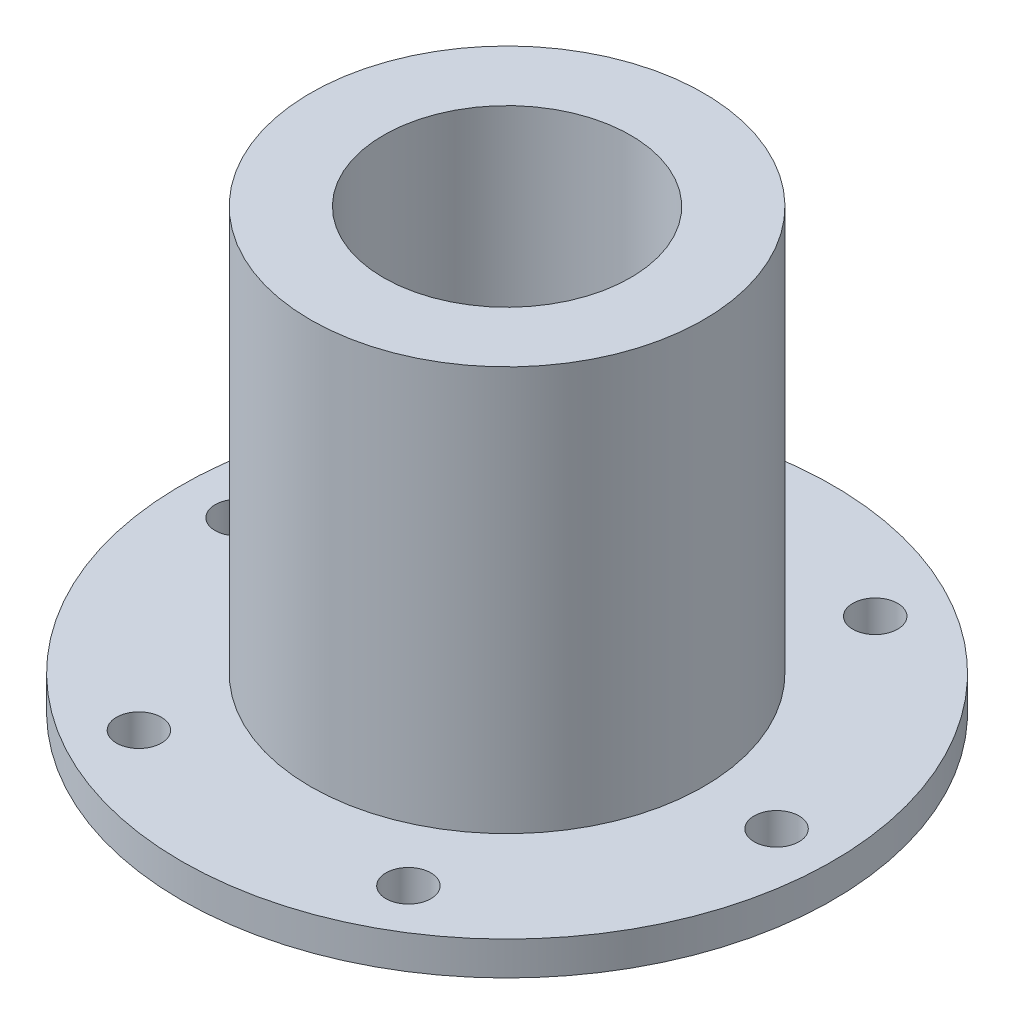
ISO-10303-21;
HEADER;
FILE_DESCRIPTION(('STEP AP214'),'2;1');
FILE_NAME('part.step','',(''),(''),'','','');
FILE_SCHEMA(('AUTOMOTIVE_DESIGN { 1 0 10303 214 1 1 1 1 }'));
ENDSEC;
DATA;
#1=APPLICATION_CONTEXT('core data for automotive mechanical design processes');
#2=APPLICATION_PROTOCOL_DEFINITION('international standard','automotive_design',2000,#1);
#3=PRODUCT_CONTEXT('',#1,'mechanical');
#4=PRODUCT('Part','Part','',(#3));
#5=PRODUCT_RELATED_PRODUCT_CATEGORY('part','',(#4));
#6=PRODUCT_DEFINITION_FORMATION('','',#4);
#7=PRODUCT_DEFINITION_CONTEXT('part definition',#1,'design');
#8=PRODUCT_DEFINITION('design','',#6,#7);
#9=PRODUCT_DEFINITION_SHAPE('','',#8);
#10=(LENGTH_UNIT() NAMED_UNIT(*) SI_UNIT(.MILLI.,.METRE.));
#11=(NAMED_UNIT(*) PLANE_ANGLE_UNIT() SI_UNIT($,.RADIAN.));
#12=(NAMED_UNIT(*) SI_UNIT($,.STERADIAN.) SOLID_ANGLE_UNIT());
#13=UNCERTAINTY_MEASURE_WITH_UNIT(LENGTH_MEASURE(1.E-05),#10,'distance_accuracy_value','');
#14=(GEOMETRIC_REPRESENTATION_CONTEXT(3) GLOBAL_UNCERTAINTY_ASSIGNED_CONTEXT((#13)) GLOBAL_UNIT_ASSIGNED_CONTEXT((#10,
#11,#12)) REPRESENTATION_CONTEXT('',''));
#15=CARTESIAN_POINT('',(0.,0.,0.));
#16=DIRECTION('',(0.,0.,1.));
#17=DIRECTION('',(1.,0.,0.));
#18=AXIS2_PLACEMENT_3D('',#15,#16,#17);
#19=CARTESIAN_POINT('',(0.,3.,0.));
#20=DIRECTION('',(0.,-1.,0.));
#21=DIRECTION('',(0.,0.,-1.));
#22=AXIS2_PLACEMENT_3D('',#19,#20,#21);
#23=CYLINDRICAL_SURFACE('',#22,29.);
#24=CARTESIAN_POINT('',(0.,3.,0.));
#25=DIRECTION('',(0.,1.,0.));
#26=DIRECTION('',(0.,0.,1.));
#27=AXIS2_PLACEMENT_3D('',#24,#25,#26);
#28=CIRCLE('',#27,29.);
#29=CARTESIAN_POINT('',(0.,3.,29.));
#30=VERTEX_POINT('',#29);
#31=EDGE_CURVE('E46',#30,#30,#28,.T.);
#32=ORIENTED_EDGE('',*,*,#31,.F.);
#33=EDGE_LOOP('',(#32));
#34=FACE_BOUND('',#33,.T.);
#35=CARTESIAN_POINT('',(0.,0.,0.));
#36=DIRECTION('',(0.,1.,0.));
#37=DIRECTION('',(0.,0.,1.));
#38=AXIS2_PLACEMENT_3D('',#35,#36,#37);
#39=CIRCLE('',#38,29.);
#40=CARTESIAN_POINT('',(0.,0.,29.));
#41=VERTEX_POINT('',#40);
#42=EDGE_CURVE('E51',#41,#41,#39,.T.);
#43=ORIENTED_EDGE('',*,*,#42,.T.);
#44=EDGE_LOOP('',(#43));
#45=FACE_BOUND('',#44,.T.);
#46=ADVANCED_FACE('F39',(#34,#45),#23,.T.);
#47=CARTESIAN_POINT('',(0.,3.,0.));
#48=DIRECTION('',(0.,1.,0.));
#49=DIRECTION('',(0.,0.,1.));
#50=AXIS2_PLACEMENT_3D('',#47,#48,#49);
#51=PLANE('',#50);
#52=CARTESIAN_POINT('',(24.,3.,0.));
#53=DIRECTION('',(0.,1.,0.));
#54=DIRECTION('',(0.,0.,1.));
#55=AXIS2_PLACEMENT_3D('',#52,#53,#54);
#56=CIRCLE('',#55,2.);
#57=CARTESIAN_POINT('',(24.,3.,2.));
#58=VERTEX_POINT('',#57);
#59=EDGE_CURVE('E63',#58,#58,#56,.T.);
#60=ORIENTED_EDGE('',*,*,#59,.F.);
#61=EDGE_LOOP('',(#60));
#62=FACE_BOUND('',#61,.T.);
#63=CARTESIAN_POINT('',(12.0000000000002,3.,-20.7846096908264));
#64=DIRECTION('',(0.,1.,0.));
#65=DIRECTION('',(0.,0.,1.));
#66=AXIS2_PLACEMENT_3D('',#63,#64,#65);
#67=CIRCLE('',#66,2.);
#68=CARTESIAN_POINT('',(12.0000000000002,3.,-18.7846096908264));
#69=VERTEX_POINT('',#68);
#70=EDGE_CURVE('E90',#69,#69,#67,.T.);
#71=ORIENTED_EDGE('',*,*,#70,.F.);
#72=EDGE_LOOP('',(#71));
#73=FACE_BOUND('',#72,.T.);
#74=CARTESIAN_POINT('',(-11.9999999999998,3.,-20.7846096908266));
#75=DIRECTION('',(0.,1.,0.));
#76=DIRECTION('',(0.,0.,1.));
#77=AXIS2_PLACEMENT_3D('',#74,#75,#76);
#78=CIRCLE('',#77,2.);
#79=CARTESIAN_POINT('',(-11.9999999999998,3.,-18.7846096908266));
#80=VERTEX_POINT('',#79);
#81=EDGE_CURVE('E86',#80,#80,#78,.T.);
#82=ORIENTED_EDGE('',*,*,#81,.F.);
#83=EDGE_LOOP('',(#82));
#84=FACE_BOUND('',#83,.T.);
#85=CARTESIAN_POINT('',(-24.,3.,-1.6759110426447E-13));
#86=DIRECTION('',(0.,1.,0.));
#87=DIRECTION('',(0.,0.,1.));
#88=AXIS2_PLACEMENT_3D('',#85,#86,#87);
#89=CIRCLE('',#88,2.);
#90=CARTESIAN_POINT('',(-24.,3.,1.99999999999983));
#91=VERTEX_POINT('',#90);
#92=EDGE_CURVE('E89',#91,#91,#89,.T.);
#93=ORIENTED_EDGE('',*,*,#92,.F.);
#94=EDGE_LOOP('',(#93));
#95=FACE_BOUND('',#94,.T.);
#96=CARTESIAN_POINT('',(-12.0000000000001,3.,20.7846096908265));
#97=DIRECTION('',(0.,1.,0.));
#98=DIRECTION('',(0.,0.,1.));
#99=AXIS2_PLACEMENT_3D('',#96,#97,#98);
#100=CIRCLE('',#99,2.);
#101=CARTESIAN_POINT('',(-12.0000000000001,3.,22.7846096908265));
#102=VERTEX_POINT('',#101);
#103=EDGE_CURVE('E93',#102,#102,#100,.T.);
#104=ORIENTED_EDGE('',*,*,#103,.F.);
#105=EDGE_LOOP('',(#104));
#106=FACE_BOUND('',#105,.T.);
#107=CARTESIAN_POINT('',(12.,3.,20.7846096908266));
#108=DIRECTION('',(0.,1.,0.));
#109=DIRECTION('',(0.,0.,1.));
#110=AXIS2_PLACEMENT_3D('',#107,#108,#109);
#111=CIRCLE('',#110,2.);
#112=CARTESIAN_POINT('',(12.,3.,22.7846096908266));
#113=VERTEX_POINT('',#112);
#114=EDGE_CURVE('E96',#113,#113,#111,.T.);
#115=ORIENTED_EDGE('',*,*,#114,.F.);
#116=EDGE_LOOP('',(#115));
#117=FACE_BOUND('',#116,.T.);
#118=CARTESIAN_POINT('',(0.,3.,0.));
#119=DIRECTION('',(0.,1.,0.));
#120=DIRECTION('',(0.,0.,1.));
#121=AXIS2_PLACEMENT_3D('',#118,#119,#120);
#122=CIRCLE('',#121,17.5);
#123=CARTESIAN_POINT('',(0.,3.,17.5));
#124=VERTEX_POINT('',#123);
#125=EDGE_CURVE('E10',#124,#124,#122,.T.);
#126=ORIENTED_EDGE('',*,*,#125,.F.);
#127=EDGE_LOOP('',(#126));
#128=FACE_BOUND('',#127,.T.);
#129=ORIENTED_EDGE('',*,*,#31,.T.);
#130=EDGE_LOOP('',(#129));
#131=FACE_BOUND('',#130,.T.);
#132=ADVANCED_FACE('F107',(#62,#73,#84,#95,#106,#117,#128,#131),#51,.T.);
#133=CARTESIAN_POINT('',(0.,0.,0.));
#134=DIRECTION('',(0.,1.,0.));
#135=DIRECTION('',(0.,0.,1.));
#136=AXIS2_PLACEMENT_3D('',#133,#134,#135);
#137=PLANE('',#136);
#138=CARTESIAN_POINT('',(24.,0.,0.));
#139=DIRECTION('',(0.,1.,0.));
#140=DIRECTION('',(0.,0.,1.));
#141=AXIS2_PLACEMENT_3D('',#138,#139,#140);
#142=CIRCLE('',#141,2.);
#143=CARTESIAN_POINT('',(24.,0.,2.));
#144=VERTEX_POINT('',#143);
#145=EDGE_CURVE('E42',#144,#144,#142,.T.);
#146=ORIENTED_EDGE('',*,*,#145,.T.);
#147=EDGE_LOOP('',(#146));
#148=FACE_BOUND('',#147,.T.);
#149=CARTESIAN_POINT('',(12.0000000000002,0.,-20.7846096908264));
#150=DIRECTION('',(0.,1.,0.));
#151=DIRECTION('',(0.,0.,1.));
#152=AXIS2_PLACEMENT_3D('',#149,#150,#151);
#153=CIRCLE('',#152,2.);
#154=CARTESIAN_POINT('',(12.0000000000002,0.,-18.7846096908264));
#155=VERTEX_POINT('',#154);
#156=EDGE_CURVE('E71',#155,#155,#153,.T.);
#157=ORIENTED_EDGE('',*,*,#156,.T.);
#158=EDGE_LOOP('',(#157));
#159=FACE_BOUND('',#158,.T.);
#160=CARTESIAN_POINT('',(-11.9999999999998,0.,-20.7846096908266));
#161=DIRECTION('',(0.,1.,0.));
#162=DIRECTION('',(0.,0.,1.));
#163=AXIS2_PLACEMENT_3D('',#160,#161,#162);
#164=CIRCLE('',#163,2.);
#165=CARTESIAN_POINT('',(-11.9999999999998,0.,-18.7846096908266));
#166=VERTEX_POINT('',#165);
#167=EDGE_CURVE('E69',#166,#166,#164,.T.);
#168=ORIENTED_EDGE('',*,*,#167,.T.);
#169=EDGE_LOOP('',(#168));
#170=FACE_BOUND('',#169,.T.);
#171=CARTESIAN_POINT('',(-24.,0.,-1.6759110426447E-13));
#172=DIRECTION('',(0.,1.,0.));
#173=DIRECTION('',(0.,0.,1.));
#174=AXIS2_PLACEMENT_3D('',#171,#172,#173);
#175=CIRCLE('',#174,2.);
#176=CARTESIAN_POINT('',(-24.,0.,1.99999999999983));
#177=VERTEX_POINT('',#176);
#178=EDGE_CURVE('E66',#177,#177,#175,.T.);
#179=ORIENTED_EDGE('',*,*,#178,.T.);
#180=EDGE_LOOP('',(#179));
#181=FACE_BOUND('',#180,.T.);
#182=CARTESIAN_POINT('',(-12.0000000000001,0.,20.7846096908265));
#183=DIRECTION('',(0.,1.,0.));
#184=DIRECTION('',(0.,0.,1.));
#185=AXIS2_PLACEMENT_3D('',#182,#183,#184);
#186=CIRCLE('',#185,2.);
#187=CARTESIAN_POINT('',(-12.0000000000001,0.,22.7846096908265));
#188=VERTEX_POINT('',#187);
#189=EDGE_CURVE('E62',#188,#188,#186,.T.);
#190=ORIENTED_EDGE('',*,*,#189,.T.);
#191=EDGE_LOOP('',(#190));
#192=FACE_BOUND('',#191,.T.);
#193=CARTESIAN_POINT('',(12.,0.,20.7846096908266));
#194=DIRECTION('',(0.,1.,0.));
#195=DIRECTION('',(0.,0.,1.));
#196=AXIS2_PLACEMENT_3D('',#193,#194,#195);
#197=CIRCLE('',#196,2.);
#198=CARTESIAN_POINT('',(12.,0.,22.7846096908266));
#199=VERTEX_POINT('',#198);
#200=EDGE_CURVE('E59',#199,#199,#197,.T.);
#201=ORIENTED_EDGE('',*,*,#200,.T.);
#202=EDGE_LOOP('',(#201));
#203=FACE_BOUND('',#202,.T.);
#204=CARTESIAN_POINT('',(0.,0.,0.));
#205=DIRECTION('',(0.,1.,0.));
#206=DIRECTION('',(0.,0.,1.));
#207=AXIS2_PLACEMENT_3D('',#204,#205,#206);
#208=CIRCLE('',#207,11.);
#209=CARTESIAN_POINT('',(0.,0.,11.));
#210=VERTEX_POINT('',#209);
#211=EDGE_CURVE('E80',#210,#210,#208,.T.);
#212=ORIENTED_EDGE('',*,*,#211,.T.);
#213=EDGE_LOOP('',(#212));
#214=FACE_BOUND('',#213,.T.);
#215=ORIENTED_EDGE('',*,*,#42,.F.);
#216=EDGE_LOOP('',(#215));
#217=FACE_BOUND('',#216,.T.);
#218=ADVANCED_FACE('F110',(#148,#159,#170,#181,#192,#203,#214,#217),#137,.F.);
#219=CARTESIAN_POINT('',(0.,39.,0.));
#220=DIRECTION('',(0.,-1.,0.));
#221=DIRECTION('',(0.,0.,-1.));
#222=AXIS2_PLACEMENT_3D('',#219,#220,#221);
#223=CYLINDRICAL_SURFACE('',#222,17.5);
#224=CARTESIAN_POINT('',(0.,39.,0.));
#225=DIRECTION('',(0.,1.,0.));
#226=DIRECTION('',(0.,0.,1.));
#227=AXIS2_PLACEMENT_3D('',#224,#225,#226);
#228=CIRCLE('',#227,17.5);
#229=CARTESIAN_POINT('',(0.,39.,17.5));
#230=VERTEX_POINT('',#229);
#231=EDGE_CURVE('E54',#230,#230,#228,.T.);
#232=ORIENTED_EDGE('',*,*,#231,.F.);
#233=EDGE_LOOP('',(#232));
#234=FACE_BOUND('',#233,.T.);
#235=ORIENTED_EDGE('',*,*,#125,.T.);
#236=EDGE_LOOP('',(#235));
#237=FACE_BOUND('',#236,.T.);
#238=ADVANCED_FACE('F130',(#234,#237),#223,.T.);
#239=CARTESIAN_POINT('',(0.,39.,0.));
#240=DIRECTION('',(0.,1.,0.));
#241=DIRECTION('',(0.,0.,1.));
#242=AXIS2_PLACEMENT_3D('',#239,#240,#241);
#243=PLANE('',#242);
#244=CARTESIAN_POINT('',(0.,39.,0.));
#245=DIRECTION('',(0.,1.,0.));
#246=DIRECTION('',(0.,0.,1.));
#247=AXIS2_PLACEMENT_3D('',#244,#245,#246);
#248=CIRCLE('',#247,11.);
#249=CARTESIAN_POINT('',(0.,39.,11.));
#250=VERTEX_POINT('',#249);
#251=EDGE_CURVE('E76',#250,#250,#248,.T.);
#252=ORIENTED_EDGE('',*,*,#251,.F.);
#253=EDGE_LOOP('',(#252));
#254=FACE_BOUND('',#253,.T.);
#255=ORIENTED_EDGE('',*,*,#231,.T.);
#256=EDGE_LOOP('',(#255));
#257=FACE_BOUND('',#256,.T.);
#258=ADVANCED_FACE('F135',(#254,#257),#243,.T.);
#259=CARTESIAN_POINT('',(0.,0.,0.));
#260=DIRECTION('',(0.,1.,0.));
#261=DIRECTION('',(0.,0.,1.));
#262=AXIS2_PLACEMENT_3D('',#259,#260,#261);
#263=CYLINDRICAL_SURFACE('',#262,11.);
#264=ORIENTED_EDGE('',*,*,#211,.F.);
#265=EDGE_LOOP('',(#264));
#266=FACE_BOUND('',#265,.T.);
#267=ORIENTED_EDGE('',*,*,#251,.T.);
#268=EDGE_LOOP('',(#267));
#269=FACE_BOUND('',#268,.T.);
#270=ADVANCED_FACE('F141',(#266,#269),#263,.F.);
#271=CARTESIAN_POINT('',(12.,-7.,20.7846096908266));
#272=DIRECTION('',(0.,1.,0.));
#273=DIRECTION('',(0.,0.,1.));
#274=AXIS2_PLACEMENT_3D('',#271,#272,#273);
#275=CYLINDRICAL_SURFACE('',#274,2.);
#276=ORIENTED_EDGE('',*,*,#114,.T.);
#277=EDGE_LOOP('',(#276));
#278=FACE_BOUND('',#277,.T.);
#279=ORIENTED_EDGE('',*,*,#200,.F.);
#280=EDGE_LOOP('',(#279));
#281=FACE_BOUND('',#280,.T.);
#282=ADVANCED_FACE('F145',(#278,#281),#275,.F.);
#283=CARTESIAN_POINT('',(-12.0000000000001,-7.,20.7846096908265));
#284=DIRECTION('',(0.,1.,0.));
#285=DIRECTION('',(0.,0.,1.));
#286=AXIS2_PLACEMENT_3D('',#283,#284,#285);
#287=CYLINDRICAL_SURFACE('',#286,2.);
#288=ORIENTED_EDGE('',*,*,#103,.T.);
#289=EDGE_LOOP('',(#288));
#290=FACE_BOUND('',#289,.T.);
#291=ORIENTED_EDGE('',*,*,#189,.F.);
#292=EDGE_LOOP('',(#291));
#293=FACE_BOUND('',#292,.T.);
#294=ADVANCED_FACE('F155',(#290,#293),#287,.F.);
#295=CARTESIAN_POINT('',(-24.,-7.,-1.6759110426447E-13));
#296=DIRECTION('',(0.,1.,0.));
#297=DIRECTION('',(0.,0.,1.));
#298=AXIS2_PLACEMENT_3D('',#295,#296,#297);
#299=CYLINDRICAL_SURFACE('',#298,2.);
#300=ORIENTED_EDGE('',*,*,#92,.T.);
#301=EDGE_LOOP('',(#300));
#302=FACE_BOUND('',#301,.T.);
#303=ORIENTED_EDGE('',*,*,#178,.F.);
#304=EDGE_LOOP('',(#303));
#305=FACE_BOUND('',#304,.T.);
#306=ADVANCED_FACE('F151',(#302,#305),#299,.F.);
#307=CARTESIAN_POINT('',(-11.9999999999998,-7.,-20.7846096908266));
#308=DIRECTION('',(0.,1.,0.));
#309=DIRECTION('',(0.,0.,1.));
#310=AXIS2_PLACEMENT_3D('',#307,#308,#309);
#311=CYLINDRICAL_SURFACE('',#310,2.);
#312=ORIENTED_EDGE('',*,*,#81,.T.);
#313=EDGE_LOOP('',(#312));
#314=FACE_BOUND('',#313,.T.);
#315=ORIENTED_EDGE('',*,*,#167,.F.);
#316=EDGE_LOOP('',(#315));
#317=FACE_BOUND('',#316,.T.);
#318=ADVANCED_FACE('F147',(#314,#317),#311,.F.);
#319=CARTESIAN_POINT('',(12.0000000000002,-7.,-20.7846096908264));
#320=DIRECTION('',(0.,1.,0.));
#321=DIRECTION('',(0.,0.,1.));
#322=AXIS2_PLACEMENT_3D('',#319,#320,#321);
#323=CYLINDRICAL_SURFACE('',#322,2.);
#324=ORIENTED_EDGE('',*,*,#70,.T.);
#325=EDGE_LOOP('',(#324));
#326=FACE_BOUND('',#325,.T.);
#327=ORIENTED_EDGE('',*,*,#156,.F.);
#328=EDGE_LOOP('',(#327));
#329=FACE_BOUND('',#328,.T.);
#330=ADVANCED_FACE('F150',(#326,#329),#323,.F.);
#331=CARTESIAN_POINT('',(24.,-7.,0.));
#332=DIRECTION('',(0.,1.,0.));
#333=DIRECTION('',(0.,0.,1.));
#334=AXIS2_PLACEMENT_3D('',#331,#332,#333);
#335=CYLINDRICAL_SURFACE('',#334,2.);
#336=ORIENTED_EDGE('',*,*,#59,.T.);
#337=EDGE_LOOP('',(#336));
#338=FACE_BOUND('',#337,.T.);
#339=ORIENTED_EDGE('',*,*,#145,.F.);
#340=EDGE_LOOP('',(#339));
#341=FACE_BOUND('',#340,.T.);
#342=ADVANCED_FACE('F104',(#338,#341),#335,.F.);
#343=CLOSED_SHELL('',(#46,#132,#218,#238,#258,#270,#282,#294,#306,#318,#330,#342));
#344=MANIFOLD_SOLID_BREP('B2',#343);
#345=ADVANCED_BREP_SHAPE_REPRESENTATION('',(#18,#344),#14);
#346=SHAPE_DEFINITION_REPRESENTATION(#9,#345);
ENDSEC;
END-ISO-10303-21;
